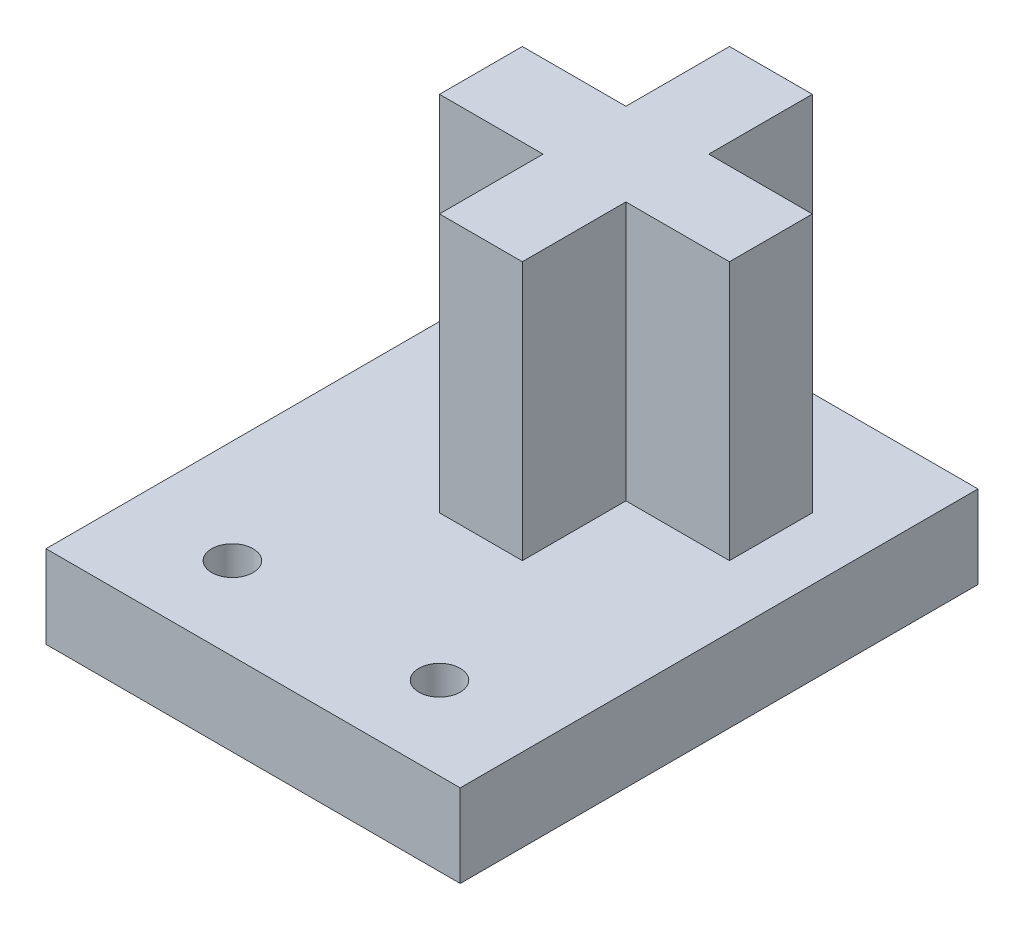
ISO-10303-21;
HEADER;
FILE_DESCRIPTION(('STEP AP214'),'2;1');
FILE_NAME('part.step','',(''),(''),'','','');
FILE_SCHEMA(('AUTOMOTIVE_DESIGN { 1 0 10303 214 1 1 1 1 }'));
ENDSEC;
DATA;
#1=APPLICATION_CONTEXT('core data for automotive mechanical design processes');
#2=APPLICATION_PROTOCOL_DEFINITION('international standard','automotive_design',2000,#1);
#3=PRODUCT_CONTEXT('',#1,'mechanical');
#4=PRODUCT('Part','Part','',(#3));
#5=PRODUCT_RELATED_PRODUCT_CATEGORY('part','',(#4));
#6=PRODUCT_DEFINITION_FORMATION('','',#4);
#7=PRODUCT_DEFINITION_CONTEXT('part definition',#1,'design');
#8=PRODUCT_DEFINITION('design','',#6,#7);
#9=PRODUCT_DEFINITION_SHAPE('','',#8);
#10=(LENGTH_UNIT() NAMED_UNIT(*) SI_UNIT(.MILLI.,.METRE.));
#11=(NAMED_UNIT(*) PLANE_ANGLE_UNIT() SI_UNIT($,.RADIAN.));
#12=(NAMED_UNIT(*) SI_UNIT($,.STERADIAN.) SOLID_ANGLE_UNIT());
#13=UNCERTAINTY_MEASURE_WITH_UNIT(LENGTH_MEASURE(1.E-05),#10,'distance_accuracy_value','');
#14=(GEOMETRIC_REPRESENTATION_CONTEXT(3) GLOBAL_UNCERTAINTY_ASSIGNED_CONTEXT((#13)) GLOBAL_UNIT_ASSIGNED_CONTEXT((#10,
#11,#12)) REPRESENTATION_CONTEXT('',''));
#15=CARTESIAN_POINT('',(0.,0.,0.));
#16=DIRECTION('',(0.,0.,1.));
#17=DIRECTION('',(1.,0.,0.));
#18=AXIS2_PLACEMENT_3D('',#15,#16,#17);
#19=CARTESIAN_POINT('',(0.,8.,0.));
#20=DIRECTION('',(0.,-1.,0.));
#21=DIRECTION('',(0.,0.,-1.));
#22=AXIS2_PLACEMENT_3D('',#19,#20,#21);
#23=PLANE('',#22);
#24=CARTESIAN_POINT('',(10.,8.,17.));
#25=DIRECTION('',(0.,1.,0.));
#26=DIRECTION('',(0.,0.,-1.));
#27=AXIS2_PLACEMENT_3D('',#24,#25,#26);
#28=CIRCLE('',#27,2.);
#29=CARTESIAN_POINT('',(10.,8.,15.));
#30=VERTEX_POINT('',#29);
#31=EDGE_CURVE('E172',#30,#30,#28,.T.);
#32=ORIENTED_EDGE('',*,*,#31,.F.);
#33=EDGE_LOOP('',(#32));
#34=FACE_BOUND('',#33,.T.);
#35=CARTESIAN_POINT('',(-10.,8.,17.));
#36=DIRECTION('',(0.,1.,0.));
#37=DIRECTION('',(0.,0.,1.));
#38=AXIS2_PLACEMENT_3D('',#35,#36,#37);
#39=CIRCLE('',#38,2.);
#40=CARTESIAN_POINT('',(-10.,8.,19.));
#41=VERTEX_POINT('',#40);
#42=EDGE_CURVE('E181',#41,#41,#39,.T.);
#43=ORIENTED_EDGE('',*,*,#42,.F.);
#44=EDGE_LOOP('',(#43));
#45=FACE_BOUND('',#44,.T.);
#46=DIRECTION('',(0.,0.,1.));
#47=VECTOR('',#46,1.);
#48=CARTESIAN_POINT('',(-4.,8.,-15.));
#49=LINE('',#48,#47);
#50=CARTESIAN_POINT('',(-4.,8.,-25.));
#51=VERTEX_POINT('',#50);
#52=CARTESIAN_POINT('',(-4.,8.,-15.));
#53=VERTEX_POINT('',#52);
#54=EDGE_CURVE('E231',#51,#53,#49,.T.);
#55=ORIENTED_EDGE('',*,*,#54,.F.);
#56=DIRECTION('',(-1.,0.,0.));
#57=VECTOR('',#56,1.);
#58=CARTESIAN_POINT('',(-20.,8.,-25.));
#59=LINE('',#58,#57);
#60=CARTESIAN_POINT('',(-20.,8.,-25.));
#61=VERTEX_POINT('',#60);
#62=EDGE_CURVE('E190',#51,#61,#59,.T.);
#63=ORIENTED_EDGE('',*,*,#62,.T.);
#64=DIRECTION('',(0.,0.,1.));
#65=VECTOR('',#64,1.);
#66=CARTESIAN_POINT('',(-20.,8.,25.));
#67=LINE('',#66,#65);
#68=CARTESIAN_POINT('',(-20.,8.,25.));
#69=VERTEX_POINT('',#68);
#70=EDGE_CURVE('E194',#61,#69,#67,.T.);
#71=ORIENTED_EDGE('',*,*,#70,.T.);
#72=DIRECTION('',(1.,0.,0.));
#73=VECTOR('',#72,1.);
#74=CARTESIAN_POINT('',(-20.,8.,25.));
#75=LINE('',#74,#73);
#76=CARTESIAN_POINT('',(20.,8.,25.));
#77=VERTEX_POINT('',#76);
#78=EDGE_CURVE('E196',#69,#77,#75,.T.);
#79=ORIENTED_EDGE('',*,*,#78,.T.);
#80=DIRECTION('',(0.,0.,-1.));
#81=VECTOR('',#80,1.);
#82=CARTESIAN_POINT('',(20.,8.,25.));
#83=LINE('',#82,#81);
#84=CARTESIAN_POINT('',(20.,8.,-25.));
#85=VERTEX_POINT('',#84);
#86=EDGE_CURVE('E187',#77,#85,#83,.T.);
#87=ORIENTED_EDGE('',*,*,#86,.T.);
#88=CARTESIAN_POINT('',(4.,8.,-25.));
#89=VERTEX_POINT('',#88);
#90=EDGE_CURVE('E192',#85,#89,#59,.T.);
#91=ORIENTED_EDGE('',*,*,#90,.T.);
#92=DIRECTION('',(0.,0.,-1.));
#93=VECTOR('',#92,1.);
#94=CARTESIAN_POINT('',(4.,8.,-25.));
#95=LINE('',#94,#93);
#96=CARTESIAN_POINT('',(4.,8.,-15.));
#97=VERTEX_POINT('',#96);
#98=EDGE_CURVE('E287',#97,#89,#95,.T.);
#99=ORIENTED_EDGE('',*,*,#98,.F.);
#100=DIRECTION('',(-1.,0.,0.));
#101=VECTOR('',#100,1.);
#102=CARTESIAN_POINT('',(4.,8.,-15.));
#103=LINE('',#102,#101);
#104=CARTESIAN_POINT('',(14.,8.,-15.));
#105=VERTEX_POINT('',#104);
#106=EDGE_CURVE('E168',#105,#97,#103,.T.);
#107=ORIENTED_EDGE('',*,*,#106,.F.);
#108=DIRECTION('',(0.,0.,-1.));
#109=VECTOR('',#108,1.);
#110=CARTESIAN_POINT('',(14.,8.,-15.));
#111=LINE('',#110,#109);
#112=CARTESIAN_POINT('',(14.,8.,-7.));
#113=VERTEX_POINT('',#112);
#114=EDGE_CURVE('E165',#113,#105,#111,.T.);
#115=ORIENTED_EDGE('',*,*,#114,.F.);
#116=DIRECTION('',(1.,0.,0.));
#117=VECTOR('',#116,1.);
#118=CARTESIAN_POINT('',(14.,8.,-7.));
#119=LINE('',#118,#117);
#120=CARTESIAN_POINT('',(4.00000000000001,8.,-7.));
#121=VERTEX_POINT('',#120);
#122=EDGE_CURVE('E269',#121,#113,#119,.T.);
#123=ORIENTED_EDGE('',*,*,#122,.F.);
#124=DIRECTION('',(0.,0.,-1.));
#125=VECTOR('',#124,1.);
#126=CARTESIAN_POINT('',(4.00000000000001,8.,-7.));
#127=LINE('',#126,#125);
#128=CARTESIAN_POINT('',(4.,8.,3.));
#129=VERTEX_POINT('',#128);
#130=EDGE_CURVE('E272',#129,#121,#127,.T.);
#131=ORIENTED_EDGE('',*,*,#130,.F.);
#132=DIRECTION('',(1.,0.,0.));
#133=VECTOR('',#132,1.);
#134=CARTESIAN_POINT('',(4.,8.,3.));
#135=LINE('',#134,#133);
#136=CARTESIAN_POINT('',(-3.99999999999999,8.,3.));
#137=VERTEX_POINT('',#136);
#138=EDGE_CURVE('E275',#137,#129,#135,.T.);
#139=ORIENTED_EDGE('',*,*,#138,.F.);
#140=DIRECTION('',(0.,0.,1.));
#141=VECTOR('',#140,1.);
#142=CARTESIAN_POINT('',(-3.99999999999999,8.,3.));
#143=LINE('',#142,#141);
#144=CARTESIAN_POINT('',(-4.,8.,-7.));
#145=VERTEX_POINT('',#144);
#146=EDGE_CURVE('E278',#145,#137,#143,.T.);
#147=ORIENTED_EDGE('',*,*,#146,.F.);
#148=DIRECTION('',(1.,0.,0.));
#149=VECTOR('',#148,1.);
#150=CARTESIAN_POINT('',(-4.,8.,-7.));
#151=LINE('',#150,#149);
#152=CARTESIAN_POINT('',(-14.,8.,-6.99999999999999));
#153=VERTEX_POINT('',#152);
#154=EDGE_CURVE('E281',#153,#145,#151,.T.);
#155=ORIENTED_EDGE('',*,*,#154,.F.);
#156=DIRECTION('',(0.,0.,1.));
#157=VECTOR('',#156,1.);
#158=CARTESIAN_POINT('',(-14.,8.,-6.99999999999999));
#159=LINE('',#158,#157);
#160=CARTESIAN_POINT('',(-14.,8.,-15.));
#161=VERTEX_POINT('',#160);
#162=EDGE_CURVE('E53',#161,#153,#159,.T.);
#163=ORIENTED_EDGE('',*,*,#162,.F.);
#164=DIRECTION('',(-1.,0.,0.));
#165=VECTOR('',#164,1.);
#166=CARTESIAN_POINT('',(-14.,8.,-15.));
#167=LINE('',#166,#165);
#168=EDGE_CURVE('E48',#53,#161,#167,.T.);
#169=ORIENTED_EDGE('',*,*,#168,.F.);
#170=EDGE_LOOP('',(#55,#63,#71,#79,#87,#91,#99,#107,#115,#123,#131,#139,#147,#155,#163,#169));
#171=FACE_BOUND('',#170,.T.);
#172=ADVANCED_FACE('F33',(#34,#45,#171),#23,.F.);
#173=CARTESIAN_POINT('',(0.,0.,0.));
#174=DIRECTION('',(0.,-1.,0.));
#175=DIRECTION('',(0.,0.,-1.));
#176=AXIS2_PLACEMENT_3D('',#173,#174,#175);
#177=PLANE('',#176);
#178=CARTESIAN_POINT('',(-10.,0.,17.));
#179=DIRECTION('',(0.,1.,0.));
#180=DIRECTION('',(0.,0.,1.));
#181=AXIS2_PLACEMENT_3D('',#178,#179,#180);
#182=CIRCLE('',#181,2.);
#183=CARTESIAN_POINT('',(-10.,0.,19.));
#184=VERTEX_POINT('',#183);
#185=EDGE_CURVE('E179',#184,#184,#182,.T.);
#186=ORIENTED_EDGE('',*,*,#185,.T.);
#187=EDGE_LOOP('',(#186));
#188=FACE_BOUND('',#187,.T.);
#189=DIRECTION('',(0.,0.,-1.));
#190=VECTOR('',#189,1.);
#191=CARTESIAN_POINT('',(20.,0.,25.));
#192=LINE('',#191,#190);
#193=CARTESIAN_POINT('',(20.,0.,25.));
#194=VERTEX_POINT('',#193);
#195=CARTESIAN_POINT('',(20.,0.,-25.));
#196=VERTEX_POINT('',#195);
#197=EDGE_CURVE('E184',#194,#196,#192,.T.);
#198=ORIENTED_EDGE('',*,*,#197,.F.);
#199=DIRECTION('',(1.,0.,0.));
#200=VECTOR('',#199,1.);
#201=CARTESIAN_POINT('',(-20.,0.,25.));
#202=LINE('',#201,#200);
#203=CARTESIAN_POINT('',(-20.,0.,25.));
#204=VERTEX_POINT('',#203);
#205=EDGE_CURVE('E191',#204,#194,#202,.T.);
#206=ORIENTED_EDGE('',*,*,#205,.F.);
#207=DIRECTION('',(0.,0.,1.));
#208=VECTOR('',#207,1.);
#209=CARTESIAN_POINT('',(-20.,0.,25.));
#210=LINE('',#209,#208);
#211=CARTESIAN_POINT('',(-20.,0.,-25.));
#212=VERTEX_POINT('',#211);
#213=EDGE_CURVE('E203',#212,#204,#210,.T.);
#214=ORIENTED_EDGE('',*,*,#213,.F.);
#215=DIRECTION('',(-1.,0.,0.));
#216=VECTOR('',#215,1.);
#217=CARTESIAN_POINT('',(-20.,0.,-25.));
#218=LINE('',#217,#216);
#219=EDGE_CURVE('E201',#196,#212,#218,.T.);
#220=ORIENTED_EDGE('',*,*,#219,.F.);
#221=EDGE_LOOP('',(#198,#206,#214,#220));
#222=FACE_BOUND('',#221,.T.);
#223=CARTESIAN_POINT('',(10.,0.,17.));
#224=DIRECTION('',(0.,1.,0.));
#225=DIRECTION('',(0.,0.,-1.));
#226=AXIS2_PLACEMENT_3D('',#223,#224,#225);
#227=CIRCLE('',#226,2.);
#228=CARTESIAN_POINT('',(10.,0.,15.));
#229=VERTEX_POINT('',#228);
#230=EDGE_CURVE('E169',#229,#229,#227,.T.);
#231=ORIENTED_EDGE('',*,*,#230,.T.);
#232=EDGE_LOOP('',(#231));
#233=FACE_BOUND('',#232,.T.);
#234=ADVANCED_FACE('F222',(#188,#222,#233),#177,.T.);
#235=CARTESIAN_POINT('',(20.,8.,25.));
#236=DIRECTION('',(-1.,0.,0.));
#237=DIRECTION('',(0.,0.,1.));
#238=AXIS2_PLACEMENT_3D('',#235,#236,#237);
#239=PLANE('',#238);
#240=ORIENTED_EDGE('',*,*,#197,.T.);
#241=DIRECTION('',(0.,-1.,0.));
#242=VECTOR('',#241,1.);
#243=CARTESIAN_POINT('',(20.,8.,-25.));
#244=LINE('',#243,#242);
#245=EDGE_CURVE('E11',#85,#196,#244,.T.);
#246=ORIENTED_EDGE('',*,*,#245,.F.);
#247=ORIENTED_EDGE('',*,*,#86,.F.);
#248=DIRECTION('',(0.,-1.,0.));
#249=VECTOR('',#248,1.);
#250=CARTESIAN_POINT('',(20.,8.,25.));
#251=LINE('',#250,#249);
#252=EDGE_CURVE('E198',#77,#194,#251,.T.);
#253=ORIENTED_EDGE('',*,*,#252,.T.);
#254=EDGE_LOOP('',(#240,#246,#247,#253));
#255=FACE_BOUND('',#254,.T.);
#256=ADVANCED_FACE('F35',(#255),#239,.F.);
#257=CARTESIAN_POINT('',(-20.,8.,-25.));
#258=DIRECTION('',(0.,0.,1.));
#259=DIRECTION('',(1.,0.,0.));
#260=AXIS2_PLACEMENT_3D('',#257,#258,#259);
#261=PLANE('',#260);
#262=ORIENTED_EDGE('',*,*,#219,.T.);
#263=DIRECTION('',(0.,-1.,0.));
#264=VECTOR('',#263,1.);
#265=CARTESIAN_POINT('',(-20.,8.,-25.));
#266=LINE('',#265,#264);
#267=EDGE_CURVE('E41',#61,#212,#266,.T.);
#268=ORIENTED_EDGE('',*,*,#267,.F.);
#269=ORIENTED_EDGE('',*,*,#62,.F.);
#270=DIRECTION('',(0.,-1.,0.));
#271=VECTOR('',#270,1.);
#272=CARTESIAN_POINT('',(-4.,33.,-25.));
#273=LINE('',#272,#271);
#274=CARTESIAN_POINT('',(-4.,33.,-25.));
#275=VERTEX_POINT('',#274);
#276=EDGE_CURVE('E174',#275,#51,#273,.T.);
#277=ORIENTED_EDGE('',*,*,#276,.F.);
#278=DIRECTION('',(-1.,0.,0.));
#279=VECTOR('',#278,1.);
#280=CARTESIAN_POINT('',(-4.,33.,-25.));
#281=LINE('',#280,#279);
#282=CARTESIAN_POINT('',(4.,33.,-25.));
#283=VERTEX_POINT('',#282);
#284=EDGE_CURVE('E155',#283,#275,#281,.T.);
#285=ORIENTED_EDGE('',*,*,#284,.F.);
#286=DIRECTION('',(0.,-1.,0.));
#287=VECTOR('',#286,1.);
#288=CARTESIAN_POINT('',(4.,33.,-25.));
#289=LINE('',#288,#287);
#290=EDGE_CURVE('E152',#283,#89,#289,.T.);
#291=ORIENTED_EDGE('',*,*,#290,.T.);
#292=ORIENTED_EDGE('',*,*,#90,.F.);
#293=ORIENTED_EDGE('',*,*,#245,.T.);
#294=EDGE_LOOP('',(#262,#268,#269,#277,#285,#291,#292,#293));
#295=FACE_BOUND('',#294,.T.);
#296=ADVANCED_FACE('F234',(#295),#261,.F.);
#297=CARTESIAN_POINT('',(-20.,8.,25.));
#298=DIRECTION('',(1.,0.,0.));
#299=DIRECTION('',(0.,0.,-1.));
#300=AXIS2_PLACEMENT_3D('',#297,#298,#299);
#301=PLANE('',#300);
#302=ORIENTED_EDGE('',*,*,#213,.T.);
#303=DIRECTION('',(0.,-1.,0.));
#304=VECTOR('',#303,1.);
#305=CARTESIAN_POINT('',(-20.,8.,25.));
#306=LINE('',#305,#304);
#307=EDGE_CURVE('E208',#69,#204,#306,.T.);
#308=ORIENTED_EDGE('',*,*,#307,.F.);
#309=ORIENTED_EDGE('',*,*,#70,.F.);
#310=ORIENTED_EDGE('',*,*,#267,.T.);
#311=EDGE_LOOP('',(#302,#308,#309,#310));
#312=FACE_BOUND('',#311,.T.);
#313=ADVANCED_FACE('F215',(#312),#301,.F.);
#314=CARTESIAN_POINT('',(-20.,8.,25.));
#315=DIRECTION('',(0.,0.,-1.));
#316=DIRECTION('',(-1.,0.,0.));
#317=AXIS2_PLACEMENT_3D('',#314,#315,#316);
#318=PLANE('',#317);
#319=ORIENTED_EDGE('',*,*,#205,.T.);
#320=ORIENTED_EDGE('',*,*,#252,.F.);
#321=ORIENTED_EDGE('',*,*,#78,.F.);
#322=ORIENTED_EDGE('',*,*,#307,.T.);
#323=EDGE_LOOP('',(#319,#320,#321,#322));
#324=FACE_BOUND('',#323,.T.);
#325=ADVANCED_FACE('F226',(#324),#318,.F.);
#326=CARTESIAN_POINT('',(-10.,8.,17.));
#327=DIRECTION('',(0.,-1.,0.));
#328=DIRECTION('',(0.,0.,-1.));
#329=AXIS2_PLACEMENT_3D('',#326,#327,#328);
#330=CYLINDRICAL_SURFACE('',#329,2.);
#331=ORIENTED_EDGE('',*,*,#42,.T.);
#332=EDGE_LOOP('',(#331));
#333=FACE_BOUND('',#332,.T.);
#334=ORIENTED_EDGE('',*,*,#185,.F.);
#335=EDGE_LOOP('',(#334));
#336=FACE_BOUND('',#335,.T.);
#337=ADVANCED_FACE('F355',(#333,#336),#330,.F.);
#338=CARTESIAN_POINT('',(10.,8.,17.));
#339=DIRECTION('',(0.,-1.,0.));
#340=DIRECTION('',(0.,0.,-1.));
#341=AXIS2_PLACEMENT_3D('',#338,#339,#340);
#342=CYLINDRICAL_SURFACE('',#341,2.);
#343=ORIENTED_EDGE('',*,*,#31,.T.);
#344=EDGE_LOOP('',(#343));
#345=FACE_BOUND('',#344,.T.);
#346=ORIENTED_EDGE('',*,*,#230,.F.);
#347=EDGE_LOOP('',(#346));
#348=FACE_BOUND('',#347,.T.);
#349=ADVANCED_FACE('F401',(#345,#348),#342,.F.);
#350=CARTESIAN_POINT('',(4.,33.,-15.));
#351=DIRECTION('',(0.,0.,1.));
#352=DIRECTION('',(1.,0.,0.));
#353=AXIS2_PLACEMENT_3D('',#350,#351,#352);
#354=PLANE('',#353);
#355=ORIENTED_EDGE('',*,*,#106,.T.);
#356=DIRECTION('',(0.,-1.,0.));
#357=VECTOR('',#356,1.);
#358=CARTESIAN_POINT('',(4.,33.,-15.));
#359=LINE('',#358,#357);
#360=CARTESIAN_POINT('',(4.,33.,-15.));
#361=VERTEX_POINT('',#360);
#362=EDGE_CURVE('E149',#361,#97,#359,.T.);
#363=ORIENTED_EDGE('',*,*,#362,.F.);
#364=DIRECTION('',(-1.,0.,0.));
#365=VECTOR('',#364,1.);
#366=CARTESIAN_POINT('',(4.,33.,-15.));
#367=LINE('',#366,#365);
#368=CARTESIAN_POINT('',(14.,33.,-15.));
#369=VERTEX_POINT('',#368);
#370=EDGE_CURVE('E156',#369,#361,#367,.T.);
#371=ORIENTED_EDGE('',*,*,#370,.F.);
#372=DIRECTION('',(0.,-1.,0.));
#373=VECTOR('',#372,1.);
#374=CARTESIAN_POINT('',(14.,33.,-15.));
#375=LINE('',#374,#373);
#376=EDGE_CURVE('E265',#369,#105,#375,.T.);
#377=ORIENTED_EDGE('',*,*,#376,.T.);
#378=EDGE_LOOP('',(#355,#363,#371,#377));
#379=FACE_BOUND('',#378,.T.);
#380=ADVANCED_FACE('F167',(#379),#354,.F.);
#381=CARTESIAN_POINT('',(4.,33.,-25.));
#382=DIRECTION('',(-1.,0.,0.));
#383=DIRECTION('',(0.,0.,1.));
#384=AXIS2_PLACEMENT_3D('',#381,#382,#383);
#385=PLANE('',#384);
#386=ORIENTED_EDGE('',*,*,#98,.T.);
#387=ORIENTED_EDGE('',*,*,#290,.F.);
#388=DIRECTION('',(0.,0.,-1.));
#389=VECTOR('',#388,1.);
#390=CARTESIAN_POINT('',(4.,33.,-25.));
#391=LINE('',#390,#389);
#392=EDGE_CURVE('E144',#361,#283,#391,.T.);
#393=ORIENTED_EDGE('',*,*,#392,.F.);
#394=ORIENTED_EDGE('',*,*,#362,.T.);
#395=EDGE_LOOP('',(#386,#387,#393,#394));
#396=FACE_BOUND('',#395,.T.);
#397=ADVANCED_FACE('F147',(#396),#385,.F.);
#398=CARTESIAN_POINT('',(-4.,33.,-15.));
#399=DIRECTION('',(1.,0.,0.));
#400=DIRECTION('',(0.,0.,-1.));
#401=AXIS2_PLACEMENT_3D('',#398,#399,#400);
#402=PLANE('',#401);
#403=ORIENTED_EDGE('',*,*,#54,.T.);
#404=DIRECTION('',(0.,-1.,0.));
#405=VECTOR('',#404,1.);
#406=CARTESIAN_POINT('',(-4.,33.,-15.));
#407=LINE('',#406,#405);
#408=CARTESIAN_POINT('',(-4.,33.,-15.));
#409=VERTEX_POINT('',#408);
#410=EDGE_CURVE('E241',#409,#53,#407,.T.);
#411=ORIENTED_EDGE('',*,*,#410,.F.);
#412=DIRECTION('',(0.,0.,1.));
#413=VECTOR('',#412,1.);
#414=CARTESIAN_POINT('',(-4.,33.,-15.));
#415=LINE('',#414,#413);
#416=EDGE_CURVE('E240',#275,#409,#415,.T.);
#417=ORIENTED_EDGE('',*,*,#416,.F.);
#418=ORIENTED_EDGE('',*,*,#276,.T.);
#419=EDGE_LOOP('',(#403,#411,#417,#418));
#420=FACE_BOUND('',#419,.T.);
#421=ADVANCED_FACE('F237',(#420),#402,.F.);
#422=CARTESIAN_POINT('',(-14.,33.,-15.));
#423=DIRECTION('',(0.,0.,1.));
#424=DIRECTION('',(1.,0.,0.));
#425=AXIS2_PLACEMENT_3D('',#422,#423,#424);
#426=PLANE('',#425);
#427=ORIENTED_EDGE('',*,*,#168,.T.);
#428=DIRECTION('',(0.,-1.,0.));
#429=VECTOR('',#428,1.);
#430=CARTESIAN_POINT('',(-14.,33.,-15.));
#431=LINE('',#430,#429);
#432=CARTESIAN_POINT('',(-14.,33.,-15.));
#433=VERTEX_POINT('',#432);
#434=EDGE_CURVE('E242',#433,#161,#431,.T.);
#435=ORIENTED_EDGE('',*,*,#434,.F.);
#436=DIRECTION('',(-1.,0.,0.));
#437=VECTOR('',#436,1.);
#438=CARTESIAN_POINT('',(-14.,33.,-15.));
#439=LINE('',#438,#437);
#440=EDGE_CURVE('E303',#409,#433,#439,.T.);
#441=ORIENTED_EDGE('',*,*,#440,.F.);
#442=ORIENTED_EDGE('',*,*,#410,.T.);
#443=EDGE_LOOP('',(#427,#435,#441,#442));
#444=FACE_BOUND('',#443,.T.);
#445=ADVANCED_FACE('F309',(#444),#426,.F.);
#446=CARTESIAN_POINT('',(-14.,33.,-6.99999999999999));
#447=DIRECTION('',(1.,0.,0.));
#448=DIRECTION('',(0.,0.,-1.));
#449=AXIS2_PLACEMENT_3D('',#446,#447,#448);
#450=PLANE('',#449);
#451=ORIENTED_EDGE('',*,*,#162,.T.);
#452=DIRECTION('',(0.,-1.,0.));
#453=VECTOR('',#452,1.);
#454=CARTESIAN_POINT('',(-14.,33.,-6.99999999999999));
#455=LINE('',#454,#453);
#456=CARTESIAN_POINT('',(-14.,33.,-6.99999999999999));
#457=VERTEX_POINT('',#456);
#458=EDGE_CURVE('E247',#457,#153,#455,.T.);
#459=ORIENTED_EDGE('',*,*,#458,.F.);
#460=DIRECTION('',(0.,0.,1.));
#461=VECTOR('',#460,1.);
#462=CARTESIAN_POINT('',(-14.,33.,-6.99999999999999));
#463=LINE('',#462,#461);
#464=EDGE_CURVE('E301',#433,#457,#463,.T.);
#465=ORIENTED_EDGE('',*,*,#464,.F.);
#466=ORIENTED_EDGE('',*,*,#434,.T.);
#467=EDGE_LOOP('',(#451,#459,#465,#466));
#468=FACE_BOUND('',#467,.T.);
#469=ADVANCED_FACE('F313',(#468),#450,.F.);
#470=CARTESIAN_POINT('',(-4.,33.,-7.));
#471=DIRECTION('',(0.,0.,-1.));
#472=DIRECTION('',(-1.,0.,0.));
#473=AXIS2_PLACEMENT_3D('',#470,#471,#472);
#474=PLANE('',#473);
#475=ORIENTED_EDGE('',*,*,#154,.T.);
#476=DIRECTION('',(0.,-1.,0.));
#477=VECTOR('',#476,1.);
#478=CARTESIAN_POINT('',(-4.,33.,-7.));
#479=LINE('',#478,#477);
#480=CARTESIAN_POINT('',(-4.,33.,-7.));
#481=VERTEX_POINT('',#480);
#482=EDGE_CURVE('E250',#481,#145,#479,.T.);
#483=ORIENTED_EDGE('',*,*,#482,.F.);
#484=DIRECTION('',(1.,0.,0.));
#485=VECTOR('',#484,1.);
#486=CARTESIAN_POINT('',(-4.,33.,-7.));
#487=LINE('',#486,#485);
#488=EDGE_CURVE('E299',#457,#481,#487,.T.);
#489=ORIENTED_EDGE('',*,*,#488,.F.);
#490=ORIENTED_EDGE('',*,*,#458,.T.);
#491=EDGE_LOOP('',(#475,#483,#489,#490));
#492=FACE_BOUND('',#491,.T.);
#493=ADVANCED_FACE('F319',(#492),#474,.F.);
#494=CARTESIAN_POINT('',(-3.99999999999999,33.,3.));
#495=DIRECTION('',(1.,0.,0.));
#496=DIRECTION('',(0.,0.,-1.));
#497=AXIS2_PLACEMENT_3D('',#494,#495,#496);
#498=PLANE('',#497);
#499=ORIENTED_EDGE('',*,*,#146,.T.);
#500=DIRECTION('',(0.,-1.,0.));
#501=VECTOR('',#500,1.);
#502=CARTESIAN_POINT('',(-3.99999999999999,33.,3.));
#503=LINE('',#502,#501);
#504=CARTESIAN_POINT('',(-3.99999999999999,33.,3.));
#505=VERTEX_POINT('',#504);
#506=EDGE_CURVE('E253',#505,#137,#503,.T.);
#507=ORIENTED_EDGE('',*,*,#506,.F.);
#508=DIRECTION('',(0.,0.,1.));
#509=VECTOR('',#508,1.);
#510=CARTESIAN_POINT('',(-3.99999999999999,33.,3.));
#511=LINE('',#510,#509);
#512=EDGE_CURVE('E297',#481,#505,#511,.T.);
#513=ORIENTED_EDGE('',*,*,#512,.F.);
#514=ORIENTED_EDGE('',*,*,#482,.T.);
#515=EDGE_LOOP('',(#499,#507,#513,#514));
#516=FACE_BOUND('',#515,.T.);
#517=ADVANCED_FACE('F321',(#516),#498,.F.);
#518=CARTESIAN_POINT('',(4.,33.,3.));
#519=DIRECTION('',(0.,0.,-1.));
#520=DIRECTION('',(-1.,0.,0.));
#521=AXIS2_PLACEMENT_3D('',#518,#519,#520);
#522=PLANE('',#521);
#523=ORIENTED_EDGE('',*,*,#138,.T.);
#524=DIRECTION('',(0.,-1.,0.));
#525=VECTOR('',#524,1.);
#526=CARTESIAN_POINT('',(4.,33.,3.));
#527=LINE('',#526,#525);
#528=CARTESIAN_POINT('',(4.,33.,3.));
#529=VERTEX_POINT('',#528);
#530=EDGE_CURVE('E256',#529,#129,#527,.T.);
#531=ORIENTED_EDGE('',*,*,#530,.F.);
#532=DIRECTION('',(1.,0.,0.));
#533=VECTOR('',#532,1.);
#534=CARTESIAN_POINT('',(4.,33.,3.));
#535=LINE('',#534,#533);
#536=EDGE_CURVE('E295',#505,#529,#535,.T.);
#537=ORIENTED_EDGE('',*,*,#536,.F.);
#538=ORIENTED_EDGE('',*,*,#506,.T.);
#539=EDGE_LOOP('',(#523,#531,#537,#538));
#540=FACE_BOUND('',#539,.T.);
#541=ADVANCED_FACE('F325',(#540),#522,.F.);
#542=CARTESIAN_POINT('',(4.00000000000001,33.,-7.));
#543=DIRECTION('',(-1.,0.,0.));
#544=DIRECTION('',(0.,0.,1.));
#545=AXIS2_PLACEMENT_3D('',#542,#543,#544);
#546=PLANE('',#545);
#547=ORIENTED_EDGE('',*,*,#130,.T.);
#548=DIRECTION('',(0.,-1.,0.));
#549=VECTOR('',#548,1.);
#550=CARTESIAN_POINT('',(4.00000000000001,33.,-7.));
#551=LINE('',#550,#549);
#552=CARTESIAN_POINT('',(4.00000000000001,33.,-7.));
#553=VERTEX_POINT('',#552);
#554=EDGE_CURVE('E259',#553,#121,#551,.T.);
#555=ORIENTED_EDGE('',*,*,#554,.F.);
#556=DIRECTION('',(0.,0.,-1.));
#557=VECTOR('',#556,1.);
#558=CARTESIAN_POINT('',(4.00000000000001,33.,-7.));
#559=LINE('',#558,#557);
#560=EDGE_CURVE('E293',#529,#553,#559,.T.);
#561=ORIENTED_EDGE('',*,*,#560,.F.);
#562=ORIENTED_EDGE('',*,*,#530,.T.);
#563=EDGE_LOOP('',(#547,#555,#561,#562));
#564=FACE_BOUND('',#563,.T.);
#565=ADVANCED_FACE('F331',(#564),#546,.F.);
#566=CARTESIAN_POINT('',(14.,33.,-7.));
#567=DIRECTION('',(0.,0.,-1.));
#568=DIRECTION('',(-1.,0.,0.));
#569=AXIS2_PLACEMENT_3D('',#566,#567,#568);
#570=PLANE('',#569);
#571=ORIENTED_EDGE('',*,*,#122,.T.);
#572=DIRECTION('',(0.,-1.,0.));
#573=VECTOR('',#572,1.);
#574=CARTESIAN_POINT('',(14.,33.,-7.));
#575=LINE('',#574,#573);
#576=CARTESIAN_POINT('',(14.,33.,-7.));
#577=VERTEX_POINT('',#576);
#578=EDGE_CURVE('E262',#577,#113,#575,.T.);
#579=ORIENTED_EDGE('',*,*,#578,.F.);
#580=DIRECTION('',(1.,0.,0.));
#581=VECTOR('',#580,1.);
#582=CARTESIAN_POINT('',(14.,33.,-7.));
#583=LINE('',#582,#581);
#584=EDGE_CURVE('E291',#553,#577,#583,.T.);
#585=ORIENTED_EDGE('',*,*,#584,.F.);
#586=ORIENTED_EDGE('',*,*,#554,.T.);
#587=EDGE_LOOP('',(#571,#579,#585,#586));
#588=FACE_BOUND('',#587,.T.);
#589=ADVANCED_FACE('F333',(#588),#570,.F.);
#590=CARTESIAN_POINT('',(14.,33.,-15.));
#591=DIRECTION('',(-1.,0.,0.));
#592=DIRECTION('',(0.,0.,1.));
#593=AXIS2_PLACEMENT_3D('',#590,#591,#592);
#594=PLANE('',#593);
#595=ORIENTED_EDGE('',*,*,#114,.T.);
#596=ORIENTED_EDGE('',*,*,#376,.F.);
#597=DIRECTION('',(0.,0.,-1.));
#598=VECTOR('',#597,1.);
#599=CARTESIAN_POINT('',(14.,33.,-15.));
#600=LINE('',#599,#598);
#601=EDGE_CURVE('E161',#577,#369,#600,.T.);
#602=ORIENTED_EDGE('',*,*,#601,.F.);
#603=ORIENTED_EDGE('',*,*,#578,.T.);
#604=EDGE_LOOP('',(#595,#596,#602,#603));
#605=FACE_BOUND('',#604,.T.);
#606=ADVANCED_FACE('F335',(#605),#594,.F.);
#607=CARTESIAN_POINT('',(0.,33.,0.));
#608=DIRECTION('',(0.,-1.,0.));
#609=DIRECTION('',(0.,0.,-1.));
#610=AXIS2_PLACEMENT_3D('',#607,#608,#609);
#611=PLANE('',#610);
#612=ORIENTED_EDGE('',*,*,#370,.T.);
#613=ORIENTED_EDGE('',*,*,#392,.T.);
#614=ORIENTED_EDGE('',*,*,#284,.T.);
#615=ORIENTED_EDGE('',*,*,#416,.T.);
#616=ORIENTED_EDGE('',*,*,#440,.T.);
#617=ORIENTED_EDGE('',*,*,#464,.T.);
#618=ORIENTED_EDGE('',*,*,#488,.T.);
#619=ORIENTED_EDGE('',*,*,#512,.T.);
#620=ORIENTED_EDGE('',*,*,#536,.T.);
#621=ORIENTED_EDGE('',*,*,#560,.T.);
#622=ORIENTED_EDGE('',*,*,#584,.T.);
#623=ORIENTED_EDGE('',*,*,#601,.T.);
#624=EDGE_LOOP('',(#612,#613,#614,#615,#616,#617,#618,#619,#620,#621,#622,#623));
#625=FACE_BOUND('',#624,.T.);
#626=ADVANCED_FACE('F159',(#625),#611,.F.);
#627=CLOSED_SHELL('',(#172,#234,#256,#296,#313,#325,#337,#349,#380,#397,#421,#445,#469,#493,
#517,#541,#565,#589,#606,#626));
#628=MANIFOLD_SOLID_BREP('B2',#627);
#629=ADVANCED_BREP_SHAPE_REPRESENTATION('',(#18,#628),#14);
#630=SHAPE_DEFINITION_REPRESENTATION(#9,#629);
ENDSEC;
END-ISO-10303-21;
